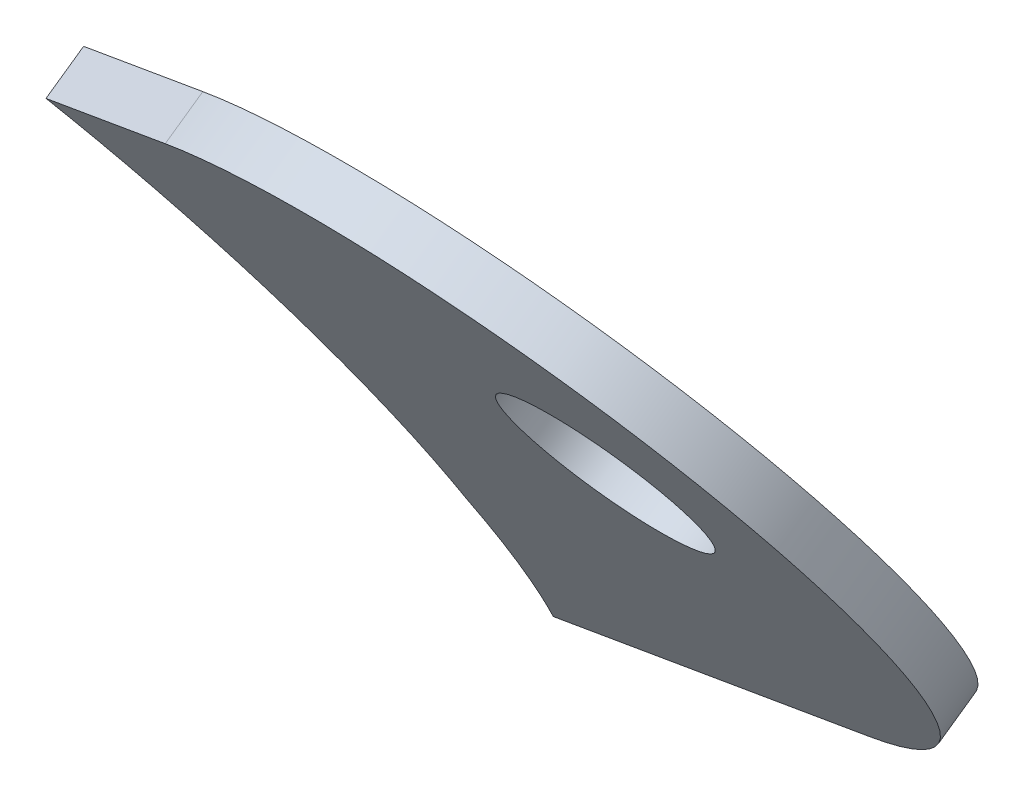
ISO-10303-21;
HEADER;
FILE_DESCRIPTION(('STEP AP214'),'2;1');
FILE_NAME('part.step','',(''),(''),'','','');
FILE_SCHEMA(('AUTOMOTIVE_DESIGN { 1 0 10303 214 1 1 1 1 }'));
ENDSEC;
DATA;
#1=APPLICATION_CONTEXT('core data for automotive mechanical design processes');
#2=APPLICATION_PROTOCOL_DEFINITION('international standard','automotive_design',2000,#1);
#3=PRODUCT_CONTEXT('',#1,'mechanical');
#4=PRODUCT('Part','Part','',(#3));
#5=PRODUCT_RELATED_PRODUCT_CATEGORY('part','',(#4));
#6=PRODUCT_DEFINITION_FORMATION('','',#4);
#7=PRODUCT_DEFINITION_CONTEXT('part definition',#1,'design');
#8=PRODUCT_DEFINITION('design','',#6,#7);
#9=PRODUCT_DEFINITION_SHAPE('','',#8);
#10=(LENGTH_UNIT() NAMED_UNIT(*) SI_UNIT(.MILLI.,.METRE.));
#11=(NAMED_UNIT(*) PLANE_ANGLE_UNIT() SI_UNIT($,.RADIAN.));
#12=(NAMED_UNIT(*) SI_UNIT($,.STERADIAN.) SOLID_ANGLE_UNIT());
#13=UNCERTAINTY_MEASURE_WITH_UNIT(LENGTH_MEASURE(1.E-05),#10,'distance_accuracy_value','');
#14=(GEOMETRIC_REPRESENTATION_CONTEXT(3) GLOBAL_UNCERTAINTY_ASSIGNED_CONTEXT((#13)) GLOBAL_UNIT_ASSIGNED_CONTEXT((#10,
#11,#12)) REPRESENTATION_CONTEXT('',''));
#15=CARTESIAN_POINT('',(0.,0.,0.));
#16=DIRECTION('',(0.,0.,1.));
#17=DIRECTION('',(1.,0.,0.));
#18=AXIS2_PLACEMENT_3D('',#15,#16,#17);
#19=CARTESIAN_POINT('',(371.264531528752,304.307260387943,-273.866483551294));
#20=DIRECTION('',(0.,-0.57357643635105,0.819152044288989));
#21=DIRECTION('',(0.,-0.819152044288989,-0.57357643635105));
#22=AXIS2_PLACEMENT_3D('',#19,#20,#21);
#23=PLANE('',#22);
#24=CARTESIAN_POINT('',(350.638988915723,295.894279485709,-279.757316197853));
#25=DIRECTION('',(0.,0.57357643635105,-0.819152044288989));
#26=DIRECTION('',(0.111787479362519,0.814017711231802,0.569981337640728));
#27=AXIS2_PLACEMENT_3D('',#24,#25,#26);
#28=ELLIPSE('',#27,21.0993504691637,12.7);
#29=CARTESIAN_POINT('',(361.617453337644,288.750687004676,-284.75931350297));
#30=VERTEX_POINT('',#29);
#31=CARTESIAN_POINT('',(363.361378453228,295.589995131943,-279.970378396122));
#32=VERTEX_POINT('',#31);
#33=EDGE_CURVE('E154',#30,#32,#28,.F.);
#34=ORIENTED_EDGE('',*,*,#33,.F.);
#35=DIRECTION('',(0.8951623663916,0.36512900698644,0.255666083110933));
#36=VECTOR('',#35,1.);
#37=CARTESIAN_POINT('',(356.299889625252,286.581698639226,-286.278055506748));
#38=LINE('',#37,#36);
#39=CARTESIAN_POINT('',(376.925432238281,294.99467954146,-280.387222860189));
#40=VERTEX_POINT('',#39);
#41=EDGE_CURVE('E108',#30,#40,#38,.T.);
#42=ORIENTED_EDGE('',*,*,#41,.T.);
#43=CARTESIAN_POINT('',(371.264531528752,304.307260387943,-273.866483551294));
#44=DIRECTION('',(0.,-0.57357643635105,0.819152044288989));
#45=DIRECTION('',(0.,-0.819152044288989,-0.57357643635105));
#46=AXIS2_PLACEMENT_3D('',#43,#44,#45);
#47=CIRCLE('',#46,12.6999999999999);
#48=CARTESIAN_POINT('',(365.603630819223,313.619841234427,-267.345744242399));
#49=VERTEX_POINT('',#48);
#50=EDGE_CURVE('E134',#40,#49,#47,.T.);
#51=ORIENTED_EDGE('',*,*,#50,.T.);
#52=DIRECTION('',(-0.895162366391605,-0.365129006986433,-0.255666083110928));
#53=VECTOR('',#52,1.);
#54=CARTESIAN_POINT('',(365.603630819223,313.619841234427,-267.345744242399));
#55=LINE('',#54,#53);
#56=CARTESIAN_POINT('',(359.828702656852,311.264297855358,-268.995113473003));
#57=VERTEX_POINT('',#56);
#58=EDGE_CURVE('E123',#49,#57,#55,.T.);
#59=ORIENTED_EDGE('',*,*,#58,.T.);
#60=CARTESIAN_POINT('',(350.874428891954,297.608713979414,-278.556856241594));
#61=DIRECTION('',(0.,-0.57357643635105,0.819152044288989));
#62=DIRECTION('',(0.111787479362517,0.814017711231802,0.569981337640728));
#63=AXIS2_PLACEMENT_3D('',#60,#61,#62);
#64=ELLIPSE('',#63,21.0993504691637,12.7);
#65=CARTESIAN_POINT('',(363.494827027708,296.445763012894,-279.37116327492));
#66=VERTEX_POINT('',#65);
#67=EDGE_CURVE('E141',#57,#66,#64,.F.);
#68=ORIENTED_EDGE('',*,*,#67,.T.);
#69=EDGE_CURVE('E145',#66,#32,#64,.F.);
#70=ORIENTED_EDGE('',*,*,#69,.T.);
#71=EDGE_LOOP('',(#34,#42,#51,#59,#68,#70));
#72=FACE_BOUND('',#71,.T.);
#73=CARTESIAN_POINT('',(375.527742298692,306.046187283716,-272.648873830478));
#74=DIRECTION('',(0.,-0.57357643635105,0.819152044288989));
#75=DIRECTION('',(0.,-0.819152044288989,-0.57357643635105));
#76=AXIS2_PLACEMENT_3D('',#73,#74,#75);
#77=CIRCLE('',#76,3.30200000000004);
#78=CARTESIAN_POINT('',(375.527742298692,303.341347233474,-274.542823223309));
#79=VERTEX_POINT('',#78);
#80=EDGE_CURVE('E115',#79,#79,#77,.T.);
#81=ORIENTED_EDGE('',*,*,#80,.F.);
#82=EDGE_LOOP('',(#81));
#83=FACE_BOUND('',#82,.T.);
#84=ADVANCED_FACE('F39',(#72,#83),#23,.T.);
#85=CARTESIAN_POINT('',(371.264531528752,305.217812980651,-275.166887421603));
#86=DIRECTION('',(0.,-0.57357643635105,0.819152044288989));
#87=DIRECTION('',(0.,-0.819152044288989,-0.57357643635105));
#88=AXIS2_PLACEMENT_3D('',#85,#86,#87);
#89=PLANE('',#88);
#90=CARTESIAN_POINT('',(350.638988915723,296.804832078416,-281.057720068162));
#91=DIRECTION('',(0.,-0.57357643635105,0.819152044288989));
#92=DIRECTION('',(0.111787479362517,0.814017711231802,0.569981337640728));
#93=AXIS2_PLACEMENT_3D('',#90,#91,#92);
#94=ELLIPSE('',#93,21.0993504691637,12.7);
#95=CARTESIAN_POINT('',(363.361378453228,296.500547724649,-281.270782266429));
#96=VERTEX_POINT('',#95);
#97=CARTESIAN_POINT('',(363.259387051478,295.641881111896,-281.872027101488));
#98=VERTEX_POINT('',#97);
#99=EDGE_CURVE('E146',#96,#98,#94,.F.);
#100=ORIENTED_EDGE('',*,*,#99,.F.);
#101=CARTESIAN_POINT('',(350.874428891954,298.519266572122,-279.857260111902));
#102=DIRECTION('',(0.,-0.57357643635105,0.819152044288989));
#103=DIRECTION('',(0.111787479362519,0.814017711231802,0.569981337640728));
#104=AXIS2_PLACEMENT_3D('',#101,#102,#103);
#105=ELLIPSE('',#104,21.0993504691637,12.7);
#106=CARTESIAN_POINT('',(359.828702656852,312.174850448066,-270.295517343311));
#107=VERTEX_POINT('',#106);
#108=EDGE_CURVE('E148',#96,#107,#105,.T.);
#109=ORIENTED_EDGE('',*,*,#108,.T.);
#110=DIRECTION('',(-0.895162366391605,-0.365129006986433,-0.255666083110928));
#111=VECTOR('',#110,1.);
#112=CARTESIAN_POINT('',(365.603630819223,314.530393827134,-268.646148112708));
#113=LINE('',#112,#111);
#114=CARTESIAN_POINT('',(365.603630819223,314.530393827134,-268.646148112708));
#115=VERTEX_POINT('',#114);
#116=EDGE_CURVE('E117',#115,#107,#113,.T.);
#117=ORIENTED_EDGE('',*,*,#116,.F.);
#118=CARTESIAN_POINT('',(371.264531528752,305.217812980651,-275.166887421603));
#119=DIRECTION('',(0.,-0.57357643635105,0.819152044288989));
#120=DIRECTION('',(0.,-0.819152044288989,-0.57357643635105));
#121=AXIS2_PLACEMENT_3D('',#118,#119,#120);
#122=CIRCLE('',#121,12.6999999999999);
#123=CARTESIAN_POINT('',(376.925432238281,295.905232134168,-281.687626730498));
#124=VERTEX_POINT('',#123);
#125=EDGE_CURVE('E114',#124,#115,#122,.T.);
#126=ORIENTED_EDGE('',*,*,#125,.F.);
#127=DIRECTION('',(0.8951623663916,0.36512900698644,0.255666083110933));
#128=VECTOR('',#127,1.);
#129=CARTESIAN_POINT('',(356.299889625252,287.492251231933,-287.578459377057));
#130=LINE('',#129,#128);
#131=CARTESIAN_POINT('',(361.617453337644,289.661239597384,-286.059717373279));
#132=VERTEX_POINT('',#131);
#133=EDGE_CURVE('E106',#132,#124,#130,.T.);
#134=ORIENTED_EDGE('',*,*,#133,.F.);
#135=CARTESIAN_POINT('',(350.638988915723,296.804832078416,-281.057720068162));
#136=DIRECTION('',(0.,0.57357643635105,-0.819152044288989));
#137=DIRECTION('',(0.111787479362519,0.814017711231802,0.569981337640728));
#138=AXIS2_PLACEMENT_3D('',#135,#136,#137);
#139=ELLIPSE('',#138,21.0993504691637,12.7);
#140=EDGE_CURVE('E93',#98,#132,#139,.T.);
#141=ORIENTED_EDGE('',*,*,#140,.F.);
#142=EDGE_LOOP('',(#100,#109,#117,#126,#134,#141));
#143=FACE_BOUND('',#142,.T.);
#144=CARTESIAN_POINT('',(375.527742298692,306.956739876424,-273.949277700787));
#145=DIRECTION('',(0.,-0.57357643635105,0.819152044288989));
#146=DIRECTION('',(0.,-0.819152044288989,-0.57357643635105));
#147=AXIS2_PLACEMENT_3D('',#144,#145,#146);
#148=CIRCLE('',#147,3.30200000000004);
#149=CARTESIAN_POINT('',(375.527742298692,304.251899826181,-275.843227093618));
#150=VERTEX_POINT('',#149);
#151=EDGE_CURVE('E120',#150,#150,#148,.T.);
#152=ORIENTED_EDGE('',*,*,#151,.T.);
#153=EDGE_LOOP('',(#152));
#154=FACE_BOUND('',#153,.T.);
#155=ADVANCED_FACE('F111',(#143,#154),#89,.F.);
#156=CARTESIAN_POINT('',(356.299889625252,286.581698639226,-286.278055506748));
#157=DIRECTION('',(-0.445740213348751,0.733274082400249,0.513444040070467));
#158=DIRECTION('',(0.,-0.57357643635105,0.819152044288989));
#159=AXIS2_PLACEMENT_3D('',#156,#157,#158);
#160=PLANE('',#159);
#161=ORIENTED_EDGE('',*,*,#41,.F.);
#162=DIRECTION('',(0.,0.57357643635105,-0.819152044288989));
#163=VECTOR('',#162,1.);
#164=CARTESIAN_POINT('',(361.617453337644,280.109905833485,-272.418999096638));
#165=LINE('',#164,#163);
#166=EDGE_CURVE('E96',#30,#132,#165,.T.);
#167=ORIENTED_EDGE('',*,*,#166,.T.);
#168=ORIENTED_EDGE('',*,*,#133,.T.);
#169=DIRECTION('',(0.,0.57357643635105,-0.819152044288989));
#170=VECTOR('',#169,1.);
#171=CARTESIAN_POINT('',(376.925432238281,294.99467954146,-280.387222860189));
#172=LINE('',#171,#170);
#173=EDGE_CURVE('E53',#40,#124,#172,.T.);
#174=ORIENTED_EDGE('',*,*,#173,.F.);
#175=EDGE_LOOP('',(#161,#167,#168,#174));
#176=FACE_BOUND('',#175,.T.);
#177=ADVANCED_FACE('F41',(#176),#160,.F.);
#178=CARTESIAN_POINT('',(371.264531528752,304.307260387943,-273.866483551294));
#179=DIRECTION('',(0.,0.57357643635105,-0.819152044288989));
#180=DIRECTION('',(0.,0.819152044288989,0.57357643635105));
#181=AXIS2_PLACEMENT_3D('',#178,#179,#180);
#182=CYLINDRICAL_SURFACE('',#181,12.6999999999999);
#183=ORIENTED_EDGE('',*,*,#125,.T.);
#184=DIRECTION('',(0.,0.57357643635105,-0.819152044288989));
#185=VECTOR('',#184,1.);
#186=CARTESIAN_POINT('',(365.603630819223,313.619841234427,-267.345744242399));
#187=LINE('',#186,#185);
#188=EDGE_CURVE('E128',#49,#115,#187,.T.);
#189=ORIENTED_EDGE('',*,*,#188,.F.);
#190=ORIENTED_EDGE('',*,*,#50,.F.);
#191=ORIENTED_EDGE('',*,*,#173,.T.);
#192=EDGE_LOOP('',(#183,#189,#190,#191));
#193=FACE_BOUND('',#192,.T.);
#194=ADVANCED_FACE('F132',(#193),#182,.T.);
#195=CARTESIAN_POINT('',(365.603630819223,313.619841234427,-267.345744242399));
#196=DIRECTION('',(0.445740213348742,-0.733274082400252,-0.513444040070469));
#197=DIRECTION('',(0.,0.57357643635105,-0.819152044288989));
#198=AXIS2_PLACEMENT_3D('',#195,#196,#197);
#199=PLANE('',#198);
#200=ORIENTED_EDGE('',*,*,#116,.T.);
#201=DIRECTION('',(0.,-0.57357643635105,0.819152044288989));
#202=VECTOR('',#201,1.);
#203=CARTESIAN_POINT('',(359.828702656852,320.715364619417,-282.492635633679));
#204=LINE('',#203,#202);
#205=EDGE_CURVE('E151',#107,#57,#204,.T.);
#206=ORIENTED_EDGE('',*,*,#205,.T.);
#207=ORIENTED_EDGE('',*,*,#58,.F.);
#208=ORIENTED_EDGE('',*,*,#188,.T.);
#209=EDGE_LOOP('',(#200,#206,#207,#208));
#210=FACE_BOUND('',#209,.T.);
#211=ADVANCED_FACE('F180',(#210),#199,.F.);
#212=CARTESIAN_POINT('',(375.527742298692,306.046187283716,-272.648873830478));
#213=DIRECTION('',(0.,0.57357643635105,-0.819152044288989));
#214=DIRECTION('',(0.,0.819152044288989,0.57357643635105));
#215=AXIS2_PLACEMENT_3D('',#212,#213,#214);
#216=CYLINDRICAL_SURFACE('',#215,3.30200000000004);
#217=ORIENTED_EDGE('',*,*,#80,.T.);
#218=EDGE_LOOP('',(#217));
#219=FACE_BOUND('',#218,.T.);
#220=ORIENTED_EDGE('',*,*,#151,.F.);
#221=EDGE_LOOP('',(#220));
#222=FACE_BOUND('',#221,.T.);
#223=ADVANCED_FACE('F168',(#219,#222),#216,.F.);
#224=CARTESIAN_POINT('',(349.763753421618,293.816444192519,-290.354547318923));
#225=DIRECTION('',(0.0892690897094424,0.304798729107071,0.948224005368542));
#226=DIRECTION('',(0.,-0.952024922064358,0.306020502202635));
#227=AXIS2_PLACEMENT_3D('',#224,#225,#226);
#228=CYLINDRICAL_SURFACE('',#227,12.7);
#229=CARTESIAN_POINT('',(363.361378453228,295.589995131942,-279.97037839612));
#230=CARTESIAN_POINT('',(363.333295435004,295.606415076199,-280.589803687465));
#231=CARTESIAN_POINT('',(363.300209546534,295.623296518979,-281.20892809686));
#232=CARTESIAN_POINT('',(363.261212388011,295.641053081652,-281.842510287841));
#233=CARTESIAN_POINT('',(363.260301142563,295.641466965523,-281.857268780235));
#234=CARTESIAN_POINT('',(363.259387051478,295.641881111896,-281.872027101488));
#235=B_SPLINE_CURVE_WITH_KNOTS('',3,(#229,#230,#231,#232,#233,#234),.UNSPECIFIED.,.F.,.F.,(4,2,
4),(0.,1.86071283139338,1.90508999773935),.UNSPECIFIED.);
#236=EDGE_CURVE('E60',#32,#98,#235,.T.);
#237=ORIENTED_EDGE('',*,*,#236,.F.);
#238=ORIENTED_EDGE('',*,*,#69,.F.);
#239=CARTESIAN_POINT('',(362.548487547414,296.739042799812,-288.565511166323));
#240=CARTESIAN_POINT('',(362.658813453686,296.71181831388,-287.806505457335));
#241=CARTESIAN_POINT('',(362.760978832842,296.685330736556,-287.046296192141));
#242=CARTESIAN_POINT('',(362.949381553587,296.633800634378,-285.523830722412));
#243=CARTESIAN_POINT('',(363.035618371797,296.608758157028,-284.761574451451));
#244=CARTESIAN_POINT('',(363.192484829356,296.560111420356,-283.236056799145));
#245=CARTESIAN_POINT('',(363.263127330493,296.536505987525,-282.472796772354));
#246=CARTESIAN_POINT('',(363.389083293774,296.490701155316,-280.944994958249));
#247=CARTESIAN_POINT('',(363.444397456337,296.468501691729,-280.180453231108));
#248=CARTESIAN_POINT('',(363.492996005157,296.44659156648,-279.400679701788));
#249=CARTESIAN_POINT('',(363.493912937069,296.446177158685,-279.385921575863));
#250=CARTESIAN_POINT('',(363.494827027708,296.445763012894,-279.37116327492));
#251=B_SPLINE_CURVE_WITH_KNOTS('',3,(#239,#240,#241,#242,#243,#244,#245,#246,#247,#248,#249,
#250),.UNSPECIFIED.,.F.,.F.,(4,2,2,2,2,4),(0.,2.30233809407309,4.60475182482806,
6.90525942996794,9.205661897521,9.25003906386683),.UNSPECIFIED.);
#252=EDGE_CURVE('E11',#96,#66,#251,.T.);
#253=ORIENTED_EDGE('',*,*,#252,.F.);
#254=ORIENTED_EDGE('',*,*,#99,.T.);
#255=EDGE_LOOP('',(#237,#238,#253,#254));
#256=FACE_BOUND('',#255,.T.);
#257=ADVANCED_FACE('F162',(#256),#228,.F.);
#258=CARTESIAN_POINT('',(350.874428891954,307.059780743473,-292.05437840227));
#259=DIRECTION('',(0.,-0.57357643635105,0.819152044288989));
#260=DIRECTION('',(0.111787479362519,0.814017711231802,0.569981337640728));
#261=AXIS2_PLACEMENT_3D('',#258,#259,#260);
#262=ELLIPSE('',#261,21.0993504691637,12.7);
#263=DIRECTION('',(0.,-0.57357643635105,0.819152044288989));
#264=VECTOR('',#263,1.);
#265=SURFACE_OF_LINEAR_EXTRUSION('',#262,#264);
#266=ORIENTED_EDGE('',*,*,#252,.T.);
#267=ORIENTED_EDGE('',*,*,#67,.F.);
#268=ORIENTED_EDGE('',*,*,#205,.F.);
#269=ORIENTED_EDGE('',*,*,#108,.F.);
#270=EDGE_LOOP('',(#266,#267,#268,#269));
#271=FACE_BOUND('',#270,.T.);
#272=ADVANCED_FACE('F158',(#271),#265,.F.);
#273=CARTESIAN_POINT('',(350.638988915723,287.253498314517,-267.417001791521));
#274=DIRECTION('',(0.,0.57357643635105,-0.819152044288989));
#275=DIRECTION('',(0.111787479362519,0.814017711231802,0.569981337640728));
#276=AXIS2_PLACEMENT_3D('',#273,#274,#275);
#277=ELLIPSE('',#276,21.0993504691637,12.7);
#278=DIRECTION('',(0.,0.57357643635105,-0.819152044288989));
#279=VECTOR('',#278,1.);
#280=SURFACE_OF_LINEAR_EXTRUSION('',#277,#279);
#281=ORIENTED_EDGE('',*,*,#33,.T.);
#282=ORIENTED_EDGE('',*,*,#236,.T.);
#283=ORIENTED_EDGE('',*,*,#140,.T.);
#284=ORIENTED_EDGE('',*,*,#166,.F.);
#285=EDGE_LOOP('',(#281,#282,#283,#284));
#286=FACE_BOUND('',#285,.T.);
#287=ADVANCED_FACE('F95',(#286),#280,.F.);
#288=CLOSED_SHELL('',(#84,#155,#177,#194,#211,#223,#257,#272,#287));
#289=MANIFOLD_SOLID_BREP('B2',#288);
#290=ADVANCED_BREP_SHAPE_REPRESENTATION('',(#18,#289),#14);
#291=SHAPE_DEFINITION_REPRESENTATION(#9,#290);
ENDSEC;
END-ISO-10303-21;
